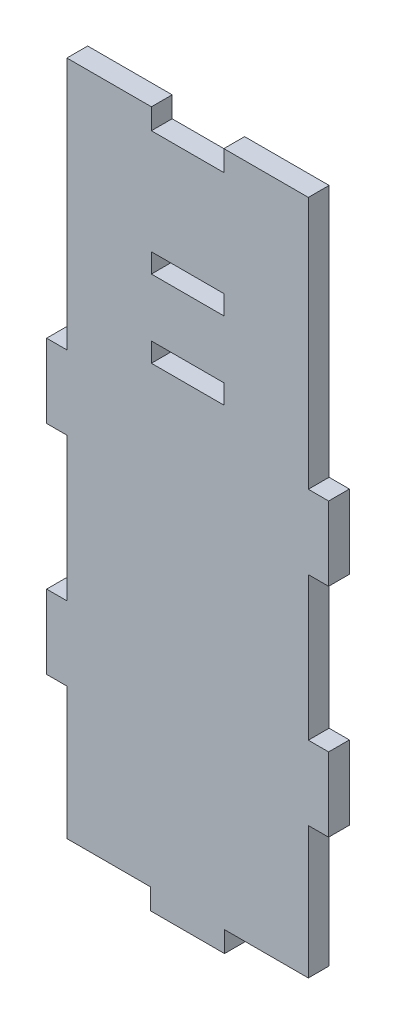
ISO-10303-21;
HEADER;
FILE_DESCRIPTION(('STEP AP214'),'2;1');
FILE_NAME('part.step','',(''),(''),'','','');
FILE_SCHEMA(('AUTOMOTIVE_DESIGN { 1 0 10303 214 1 1 1 1 }'));
ENDSEC;
DATA;
#1=APPLICATION_CONTEXT('core data for automotive mechanical design processes');
#2=APPLICATION_PROTOCOL_DEFINITION('international standard','automotive_design',2000,#1);
#3=PRODUCT_CONTEXT('',#1,'mechanical');
#4=PRODUCT('Part','Part','',(#3));
#5=PRODUCT_RELATED_PRODUCT_CATEGORY('part','',(#4));
#6=PRODUCT_DEFINITION_FORMATION('','',#4);
#7=PRODUCT_DEFINITION_CONTEXT('part definition',#1,'design');
#8=PRODUCT_DEFINITION('design','',#6,#7);
#9=PRODUCT_DEFINITION_SHAPE('','',#8);
#10=(LENGTH_UNIT() NAMED_UNIT(*) SI_UNIT(.MILLI.,.METRE.));
#11=(NAMED_UNIT(*) PLANE_ANGLE_UNIT() SI_UNIT($,.RADIAN.));
#12=(NAMED_UNIT(*) SI_UNIT($,.STERADIAN.) SOLID_ANGLE_UNIT());
#13=UNCERTAINTY_MEASURE_WITH_UNIT(LENGTH_MEASURE(1.E-05),#10,'distance_accuracy_value','');
#14=(GEOMETRIC_REPRESENTATION_CONTEXT(3) GLOBAL_UNCERTAINTY_ASSIGNED_CONTEXT((#13)) GLOBAL_UNIT_ASSIGNED_CONTEXT((#10,
#11,#12)) REPRESENTATION_CONTEXT('',''));
#15=CARTESIAN_POINT('',(0.,0.,0.));
#16=DIRECTION('',(0.,0.,1.));
#17=DIRECTION('',(1.,0.,0.));
#18=AXIS2_PLACEMENT_3D('',#15,#16,#17);
#19=CARTESIAN_POINT('',(0.,0.,4.3));
#20=DIRECTION('',(0.,0.,1.));
#21=DIRECTION('',(1.,0.,0.));
#22=AXIS2_PLACEMENT_3D('',#19,#20,#21);
#23=PLANE('',#22);
#24=DIRECTION('',(-1.,0.,0.));
#25=VECTOR('',#24,1.);
#26=CARTESIAN_POINT('',(7.50000000000001,70.,4.3));
#27=LINE('',#26,#25);
#28=CARTESIAN_POINT('',(25.,70.,4.3));
#29=VERTEX_POINT('',#28);
#30=CARTESIAN_POINT('',(7.50000000000001,70.,4.3));
#31=VERTEX_POINT('',#30);
#32=EDGE_CURVE('E336',#29,#31,#27,.T.);
#33=ORIENTED_EDGE('',*,*,#32,.T.);
#34=DIRECTION('',(0.,-1.,0.));
#35=VECTOR('',#34,1.);
#36=CARTESIAN_POINT('',(7.50000000000001,70.,4.3));
#37=LINE('',#36,#35);
#38=CARTESIAN_POINT('',(7.50000000000002,65.7,4.3));
#39=VERTEX_POINT('',#38);
#40=EDGE_CURVE('E339',#31,#39,#37,.T.);
#41=ORIENTED_EDGE('',*,*,#40,.T.);
#42=DIRECTION('',(-1.,0.,0.));
#43=VECTOR('',#42,1.);
#44=CARTESIAN_POINT('',(-7.49999999999999,65.7,4.3));
#45=LINE('',#44,#43);
#46=CARTESIAN_POINT('',(-7.49999999999999,65.7,4.3));
#47=VERTEX_POINT('',#46);
#48=EDGE_CURVE('E342',#39,#47,#45,.T.);
#49=ORIENTED_EDGE('',*,*,#48,.T.);
#50=DIRECTION('',(0.,1.,0.));
#51=VECTOR('',#50,1.);
#52=CARTESIAN_POINT('',(-7.49999999999998,70.,4.3));
#53=LINE('',#52,#51);
#54=CARTESIAN_POINT('',(-7.49999999999998,70.,4.3));
#55=VERTEX_POINT('',#54);
#56=EDGE_CURVE('E344',#47,#55,#53,.T.);
#57=ORIENTED_EDGE('',*,*,#56,.T.);
#58=DIRECTION('',(-1.,0.,0.));
#59=VECTOR('',#58,1.);
#60=CARTESIAN_POINT('',(-25.,70.,4.3));
#61=LINE('',#60,#59);
#62=CARTESIAN_POINT('',(-25.,70.,4.3));
#63=VERTEX_POINT('',#62);
#64=EDGE_CURVE('E346',#55,#63,#61,.T.);
#65=ORIENTED_EDGE('',*,*,#64,.T.);
#66=DIRECTION('',(0.,-1.,0.));
#67=VECTOR('',#66,1.);
#68=CARTESIAN_POINT('',(-25.,17.65,4.3));
#69=LINE('',#68,#67);
#70=CARTESIAN_POINT('',(-25.,17.65,4.3));
#71=VERTEX_POINT('',#70);
#72=EDGE_CURVE('E348',#63,#71,#69,.T.);
#73=ORIENTED_EDGE('',*,*,#72,.T.);
#74=DIRECTION('',(-1.,0.,0.));
#75=VECTOR('',#74,1.);
#76=CARTESIAN_POINT('',(-25.,17.65,4.3));
#77=LINE('',#76,#75);
#78=CARTESIAN_POINT('',(-29.2,17.65,4.3));
#79=VERTEX_POINT('',#78);
#80=EDGE_CURVE('E350',#71,#79,#77,.T.);
#81=ORIENTED_EDGE('',*,*,#80,.T.);
#82=DIRECTION('',(0.,-1.,0.));
#83=VECTOR('',#82,1.);
#84=CARTESIAN_POINT('',(-29.2,2.34999999999998,4.3));
#85=LINE('',#84,#83);
#86=CARTESIAN_POINT('',(-29.2,2.34999999999998,4.3));
#87=VERTEX_POINT('',#86);
#88=EDGE_CURVE('E352',#79,#87,#85,.T.);
#89=ORIENTED_EDGE('',*,*,#88,.T.);
#90=DIRECTION('',(1.,0.,0.));
#91=VECTOR('',#90,1.);
#92=CARTESIAN_POINT('',(-25.,2.34999999999998,4.3));
#93=LINE('',#92,#91);
#94=CARTESIAN_POINT('',(-25.,2.34999999999998,4.3));
#95=VERTEX_POINT('',#94);
#96=EDGE_CURVE('E354',#87,#95,#93,.T.);
#97=ORIENTED_EDGE('',*,*,#96,.T.);
#98=DIRECTION('',(0.,-1.,0.));
#99=VECTOR('',#98,1.);
#100=CARTESIAN_POINT('',(-25.,-27.35,4.3));
#101=LINE('',#100,#99);
#102=CARTESIAN_POINT('',(-25.,-27.35,4.3));
#103=VERTEX_POINT('',#102);
#104=EDGE_CURVE('E356',#95,#103,#101,.T.);
#105=ORIENTED_EDGE('',*,*,#104,.T.);
#106=DIRECTION('',(-1.,0.,0.));
#107=VECTOR('',#106,1.);
#108=CARTESIAN_POINT('',(-25.,-27.35,4.3));
#109=LINE('',#108,#107);
#110=CARTESIAN_POINT('',(-29.2,-27.35,4.3));
#111=VERTEX_POINT('',#110);
#112=EDGE_CURVE('E358',#103,#111,#109,.T.);
#113=ORIENTED_EDGE('',*,*,#112,.T.);
#114=DIRECTION('',(0.,-1.,0.));
#115=VECTOR('',#114,1.);
#116=CARTESIAN_POINT('',(-29.2,-42.65,4.3));
#117=LINE('',#116,#115);
#118=CARTESIAN_POINT('',(-29.2,-42.65,4.3));
#119=VERTEX_POINT('',#118);
#120=EDGE_CURVE('E360',#111,#119,#117,.T.);
#121=ORIENTED_EDGE('',*,*,#120,.T.);
#122=DIRECTION('',(1.,0.,0.));
#123=VECTOR('',#122,1.);
#124=CARTESIAN_POINT('',(-25.,-42.65,4.3));
#125=LINE('',#124,#123);
#126=CARTESIAN_POINT('',(-25.,-42.65,4.3));
#127=VERTEX_POINT('',#126);
#128=EDGE_CURVE('E362',#119,#127,#125,.T.);
#129=ORIENTED_EDGE('',*,*,#128,.T.);
#130=DIRECTION('',(0.,-1.,0.));
#131=VECTOR('',#130,1.);
#132=CARTESIAN_POINT('',(-25.,-70.,4.3));
#133=LINE('',#132,#131);
#134=CARTESIAN_POINT('',(-25.,-70.,4.3));
#135=VERTEX_POINT('',#134);
#136=EDGE_CURVE('E364',#127,#135,#133,.T.);
#137=ORIENTED_EDGE('',*,*,#136,.T.);
#138=DIRECTION('',(1.,0.,0.));
#139=VECTOR('',#138,1.);
#140=CARTESIAN_POINT('',(-25.,-70.,4.3));
#141=LINE('',#140,#139);
#142=CARTESIAN_POINT('',(-7.64999999999999,-70.,4.3));
#143=VERTEX_POINT('',#142);
#144=EDGE_CURVE('E366',#135,#143,#141,.T.);
#145=ORIENTED_EDGE('',*,*,#144,.T.);
#146=DIRECTION('',(0.,-1.,0.));
#147=VECTOR('',#146,1.);
#148=CARTESIAN_POINT('',(-7.64999999999999,-70.,4.3));
#149=LINE('',#148,#147);
#150=CARTESIAN_POINT('',(-7.64999999999998,-74.3,4.3));
#151=VERTEX_POINT('',#150);
#152=EDGE_CURVE('E368',#143,#151,#149,.T.);
#153=ORIENTED_EDGE('',*,*,#152,.T.);
#154=DIRECTION('',(1.,0.,0.));
#155=VECTOR('',#154,1.);
#156=CARTESIAN_POINT('',(-7.64999999999998,-74.3,4.3));
#157=LINE('',#156,#155);
#158=CARTESIAN_POINT('',(7.65000000000002,-74.3,4.3));
#159=VERTEX_POINT('',#158);
#160=EDGE_CURVE('E370',#151,#159,#157,.T.);
#161=ORIENTED_EDGE('',*,*,#160,.T.);
#162=DIRECTION('',(0.,1.,0.));
#163=VECTOR('',#162,1.);
#164=CARTESIAN_POINT('',(7.65000000000001,-70.,4.3));
#165=LINE('',#164,#163);
#166=CARTESIAN_POINT('',(7.65000000000001,-70.,4.3));
#167=VERTEX_POINT('',#166);
#168=EDGE_CURVE('E372',#159,#167,#165,.T.);
#169=ORIENTED_EDGE('',*,*,#168,.T.);
#170=DIRECTION('',(1.,0.,0.));
#171=VECTOR('',#170,1.);
#172=CARTESIAN_POINT('',(7.65000000000001,-70.,4.3));
#173=LINE('',#172,#171);
#174=CARTESIAN_POINT('',(25.,-70.,4.3));
#175=VERTEX_POINT('',#174);
#176=EDGE_CURVE('E374',#167,#175,#173,.T.);
#177=ORIENTED_EDGE('',*,*,#176,.T.);
#178=DIRECTION('',(0.,1.,0.));
#179=VECTOR('',#178,1.);
#180=CARTESIAN_POINT('',(25.,-70.,4.3));
#181=LINE('',#180,#179);
#182=CARTESIAN_POINT('',(25.,-42.65,4.3));
#183=VERTEX_POINT('',#182);
#184=EDGE_CURVE('E376',#175,#183,#181,.T.);
#185=ORIENTED_EDGE('',*,*,#184,.T.);
#186=DIRECTION('',(1.,0.,0.));
#187=VECTOR('',#186,1.);
#188=CARTESIAN_POINT('',(25.,-42.65,4.3));
#189=LINE('',#188,#187);
#190=CARTESIAN_POINT('',(29.2,-42.65,4.3));
#191=VERTEX_POINT('',#190);
#192=EDGE_CURVE('E378',#183,#191,#189,.T.);
#193=ORIENTED_EDGE('',*,*,#192,.T.);
#194=DIRECTION('',(0.,1.,0.));
#195=VECTOR('',#194,1.);
#196=CARTESIAN_POINT('',(29.2,-42.65,4.3));
#197=LINE('',#196,#195);
#198=CARTESIAN_POINT('',(29.2,-27.35,4.3));
#199=VERTEX_POINT('',#198);
#200=EDGE_CURVE('E380',#191,#199,#197,.T.);
#201=ORIENTED_EDGE('',*,*,#200,.T.);
#202=DIRECTION('',(-1.,0.,0.));
#203=VECTOR('',#202,1.);
#204=CARTESIAN_POINT('',(25.,-27.35,4.3));
#205=LINE('',#204,#203);
#206=CARTESIAN_POINT('',(25.,-27.35,4.3));
#207=VERTEX_POINT('',#206);
#208=EDGE_CURVE('E382',#199,#207,#205,.T.);
#209=ORIENTED_EDGE('',*,*,#208,.T.);
#210=DIRECTION('',(0.,1.,0.));
#211=VECTOR('',#210,1.);
#212=CARTESIAN_POINT('',(25.,-27.35,4.3));
#213=LINE('',#212,#211);
#214=CARTESIAN_POINT('',(25.,2.34999999999998,4.3));
#215=VERTEX_POINT('',#214);
#216=EDGE_CURVE('E384',#207,#215,#213,.T.);
#217=ORIENTED_EDGE('',*,*,#216,.T.);
#218=DIRECTION('',(1.,0.,0.));
#219=VECTOR('',#218,1.);
#220=CARTESIAN_POINT('',(25.,2.34999999999998,4.3));
#221=LINE('',#220,#219);
#222=CARTESIAN_POINT('',(29.2,2.34999999999998,4.3));
#223=VERTEX_POINT('',#222);
#224=EDGE_CURVE('E386',#215,#223,#221,.T.);
#225=ORIENTED_EDGE('',*,*,#224,.T.);
#226=DIRECTION('',(0.,1.,0.));
#227=VECTOR('',#226,1.);
#228=CARTESIAN_POINT('',(29.2,2.34999999999998,4.3));
#229=LINE('',#228,#227);
#230=CARTESIAN_POINT('',(29.2,17.65,4.3));
#231=VERTEX_POINT('',#230);
#232=EDGE_CURVE('E388',#223,#231,#229,.T.);
#233=ORIENTED_EDGE('',*,*,#232,.T.);
#234=DIRECTION('',(-1.,0.,0.));
#235=VECTOR('',#234,1.);
#236=CARTESIAN_POINT('',(25.,17.65,4.3));
#237=LINE('',#236,#235);
#238=CARTESIAN_POINT('',(25.,17.65,4.3));
#239=VERTEX_POINT('',#238);
#240=EDGE_CURVE('E390',#231,#239,#237,.T.);
#241=ORIENTED_EDGE('',*,*,#240,.T.);
#242=DIRECTION('',(0.,1.,0.));
#243=VECTOR('',#242,1.);
#244=CARTESIAN_POINT('',(25.,17.65,4.3));
#245=LINE('',#244,#243);
#246=EDGE_CURVE('E392',#239,#29,#245,.T.);
#247=ORIENTED_EDGE('',*,*,#246,.T.);
#248=EDGE_LOOP('',(#33,#41,#49,#57,#65,#73,#81,#89,#97,#105,#113,#121,#129,#137,#145,#153,#161,
#169,#177,#185,#193,#201,#209,#217,#225,#233,#241,#247));
#249=FACE_BOUND('',#248,.T.);
#250=DIRECTION('',(-1.,0.,0.));
#251=VECTOR('',#250,1.);
#252=CARTESIAN_POINT('',(-7.49999999999999,44.,4.3));
#253=LINE('',#252,#251);
#254=CARTESIAN_POINT('',(7.50000000000001,44.,4.3));
#255=VERTEX_POINT('',#254);
#256=CARTESIAN_POINT('',(-7.49999999999999,44.,4.3));
#257=VERTEX_POINT('',#256);
#258=EDGE_CURVE('E307',#255,#257,#253,.T.);
#259=ORIENTED_EDGE('',*,*,#258,.F.);
#260=DIRECTION('',(0.,1.,0.));
#261=VECTOR('',#260,1.);
#262=CARTESIAN_POINT('',(7.50000000000001,44.,4.3));
#263=LINE('',#262,#261);
#264=CARTESIAN_POINT('',(7.50000000000001,40.,4.3));
#265=VERTEX_POINT('',#264);
#266=EDGE_CURVE('E305',#265,#255,#263,.T.);
#267=ORIENTED_EDGE('',*,*,#266,.F.);
#268=DIRECTION('',(1.,0.,0.));
#269=VECTOR('',#268,1.);
#270=CARTESIAN_POINT('',(-7.49999999999999,40.,4.3));
#271=LINE('',#270,#269);
#272=CARTESIAN_POINT('',(-7.49999999999999,40.,4.3));
#273=VERTEX_POINT('',#272);
#274=EDGE_CURVE('E313',#273,#265,#271,.T.);
#275=ORIENTED_EDGE('',*,*,#274,.F.);
#276=DIRECTION('',(0.,-1.,0.));
#277=VECTOR('',#276,1.);
#278=CARTESIAN_POINT('',(-7.49999999999999,44.,4.3));
#279=LINE('',#278,#277);
#280=EDGE_CURVE('E310',#257,#273,#279,.T.);
#281=ORIENTED_EDGE('',*,*,#280,.F.);
#282=EDGE_LOOP('',(#259,#267,#275,#281));
#283=FACE_BOUND('',#282,.T.);
#284=DIRECTION('',(-1.,0.,0.));
#285=VECTOR('',#284,1.);
#286=CARTESIAN_POINT('',(-7.50000000000001,28.,4.3));
#287=LINE('',#286,#285);
#288=CARTESIAN_POINT('',(7.50000000000002,28.,4.3));
#289=VERTEX_POINT('',#288);
#290=CARTESIAN_POINT('',(-7.50000000000001,28.,4.3));
#291=VERTEX_POINT('',#290);
#292=EDGE_CURVE('E277',#289,#291,#287,.T.);
#293=ORIENTED_EDGE('',*,*,#292,.F.);
#294=DIRECTION('',(0.,1.,0.));
#295=VECTOR('',#294,1.);
#296=CARTESIAN_POINT('',(7.50000000000002,24.,4.3));
#297=LINE('',#296,#295);
#298=CARTESIAN_POINT('',(7.50000000000002,24.,4.3));
#299=VERTEX_POINT('',#298);
#300=EDGE_CURVE('E269',#299,#289,#297,.T.);
#301=ORIENTED_EDGE('',*,*,#300,.F.);
#302=DIRECTION('',(1.,0.,0.));
#303=VECTOR('',#302,1.);
#304=CARTESIAN_POINT('',(-7.50000000000001,24.,4.3));
#305=LINE('',#304,#303);
#306=CARTESIAN_POINT('',(-7.50000000000001,24.,4.3));
#307=VERTEX_POINT('',#306);
#308=EDGE_CURVE('E291',#307,#299,#305,.T.);
#309=ORIENTED_EDGE('',*,*,#308,.F.);
#310=DIRECTION('',(0.,-1.,0.));
#311=VECTOR('',#310,1.);
#312=CARTESIAN_POINT('',(-7.50000000000001,24.,4.3));
#313=LINE('',#312,#311);
#314=EDGE_CURVE('E289',#291,#307,#313,.T.);
#315=ORIENTED_EDGE('',*,*,#314,.F.);
#316=EDGE_LOOP('',(#293,#301,#309,#315));
#317=FACE_BOUND('',#316,.T.);
#318=ADVANCED_FACE('F36',(#249,#283,#317),#23,.T.);
#319=CARTESIAN_POINT('',(0.,0.,0.));
#320=DIRECTION('',(0.,0.,1.));
#321=DIRECTION('',(1.,0.,0.));
#322=AXIS2_PLACEMENT_3D('',#319,#320,#321);
#323=PLANE('',#322);
#324=DIRECTION('',(0.,1.,0.));
#325=VECTOR('',#324,1.);
#326=CARTESIAN_POINT('',(7.50000000000001,44.,0.));
#327=LINE('',#326,#325);
#328=CARTESIAN_POINT('',(7.50000000000001,40.,0.));
#329=VERTEX_POINT('',#328);
#330=CARTESIAN_POINT('',(7.50000000000001,44.,0.));
#331=VERTEX_POINT('',#330);
#332=EDGE_CURVE('E285',#329,#331,#327,.T.);
#333=ORIENTED_EDGE('',*,*,#332,.T.);
#334=DIRECTION('',(-1.,0.,0.));
#335=VECTOR('',#334,1.);
#336=CARTESIAN_POINT('',(-7.49999999999999,44.,0.));
#337=LINE('',#336,#335);
#338=CARTESIAN_POINT('',(-7.49999999999999,44.,0.));
#339=VERTEX_POINT('',#338);
#340=EDGE_CURVE('E318',#331,#339,#337,.T.);
#341=ORIENTED_EDGE('',*,*,#340,.T.);
#342=DIRECTION('',(0.,-1.,0.));
#343=VECTOR('',#342,1.);
#344=CARTESIAN_POINT('',(-7.49999999999999,44.,0.));
#345=LINE('',#344,#343);
#346=CARTESIAN_POINT('',(-7.49999999999999,40.,0.));
#347=VERTEX_POINT('',#346);
#348=EDGE_CURVE('E321',#339,#347,#345,.T.);
#349=ORIENTED_EDGE('',*,*,#348,.T.);
#350=DIRECTION('',(1.,0.,0.));
#351=VECTOR('',#350,1.);
#352=CARTESIAN_POINT('',(-7.49999999999999,40.,0.));
#353=LINE('',#352,#351);
#354=EDGE_CURVE('E308',#347,#329,#353,.T.);
#355=ORIENTED_EDGE('',*,*,#354,.T.);
#356=EDGE_LOOP('',(#333,#341,#349,#355));
#357=FACE_BOUND('',#356,.T.);
#358=DIRECTION('',(-1.,0.,0.));
#359=VECTOR('',#358,1.);
#360=CARTESIAN_POINT('',(7.50000000000001,70.,0.));
#361=LINE('',#360,#359);
#362=CARTESIAN_POINT('',(25.,70.,0.));
#363=VERTEX_POINT('',#362);
#364=CARTESIAN_POINT('',(7.50000000000001,70.,0.));
#365=VERTEX_POINT('',#364);
#366=EDGE_CURVE('E335',#363,#365,#361,.T.);
#367=ORIENTED_EDGE('',*,*,#366,.F.);
#368=DIRECTION('',(0.,1.,0.));
#369=VECTOR('',#368,1.);
#370=CARTESIAN_POINT('',(25.,17.65,0.));
#371=LINE('',#370,#369);
#372=CARTESIAN_POINT('',(25.,17.65,0.));
#373=VERTEX_POINT('',#372);
#374=EDGE_CURVE('E340',#373,#363,#371,.T.);
#375=ORIENTED_EDGE('',*,*,#374,.F.);
#376=DIRECTION('',(-1.,0.,0.));
#377=VECTOR('',#376,1.);
#378=CARTESIAN_POINT('',(25.,17.65,0.));
#379=LINE('',#378,#377);
#380=CARTESIAN_POINT('',(29.2,17.65,0.));
#381=VERTEX_POINT('',#380);
#382=EDGE_CURVE('E447',#381,#373,#379,.T.);
#383=ORIENTED_EDGE('',*,*,#382,.F.);
#384=DIRECTION('',(0.,1.,0.));
#385=VECTOR('',#384,1.);
#386=CARTESIAN_POINT('',(29.2,2.34999999999998,0.));
#387=LINE('',#386,#385);
#388=CARTESIAN_POINT('',(29.2,2.34999999999998,0.));
#389=VERTEX_POINT('',#388);
#390=EDGE_CURVE('E445',#389,#381,#387,.T.);
#391=ORIENTED_EDGE('',*,*,#390,.F.);
#392=DIRECTION('',(1.,0.,0.));
#393=VECTOR('',#392,1.);
#394=CARTESIAN_POINT('',(25.,2.34999999999998,0.));
#395=LINE('',#394,#393);
#396=CARTESIAN_POINT('',(25.,2.34999999999998,0.));
#397=VERTEX_POINT('',#396);
#398=EDGE_CURVE('E443',#397,#389,#395,.T.);
#399=ORIENTED_EDGE('',*,*,#398,.F.);
#400=DIRECTION('',(0.,1.,0.));
#401=VECTOR('',#400,1.);
#402=CARTESIAN_POINT('',(25.,-27.35,0.));
#403=LINE('',#402,#401);
#404=CARTESIAN_POINT('',(25.,-27.35,0.));
#405=VERTEX_POINT('',#404);
#406=EDGE_CURVE('E441',#405,#397,#403,.T.);
#407=ORIENTED_EDGE('',*,*,#406,.F.);
#408=DIRECTION('',(-1.,0.,0.));
#409=VECTOR('',#408,1.);
#410=CARTESIAN_POINT('',(25.,-27.35,0.));
#411=LINE('',#410,#409);
#412=CARTESIAN_POINT('',(29.2,-27.35,0.));
#413=VERTEX_POINT('',#412);
#414=EDGE_CURVE('E439',#413,#405,#411,.T.);
#415=ORIENTED_EDGE('',*,*,#414,.F.);
#416=DIRECTION('',(0.,1.,0.));
#417=VECTOR('',#416,1.);
#418=CARTESIAN_POINT('',(29.2,-42.65,0.));
#419=LINE('',#418,#417);
#420=CARTESIAN_POINT('',(29.2,-42.65,0.));
#421=VERTEX_POINT('',#420);
#422=EDGE_CURVE('E437',#421,#413,#419,.T.);
#423=ORIENTED_EDGE('',*,*,#422,.F.);
#424=DIRECTION('',(1.,0.,0.));
#425=VECTOR('',#424,1.);
#426=CARTESIAN_POINT('',(25.,-42.65,0.));
#427=LINE('',#426,#425);
#428=CARTESIAN_POINT('',(25.,-42.65,0.));
#429=VERTEX_POINT('',#428);
#430=EDGE_CURVE('E435',#429,#421,#427,.T.);
#431=ORIENTED_EDGE('',*,*,#430,.F.);
#432=DIRECTION('',(0.,1.,0.));
#433=VECTOR('',#432,1.);
#434=CARTESIAN_POINT('',(25.,-70.,0.));
#435=LINE('',#434,#433);
#436=CARTESIAN_POINT('',(25.,-70.,0.));
#437=VERTEX_POINT('',#436);
#438=EDGE_CURVE('E433',#437,#429,#435,.T.);
#439=ORIENTED_EDGE('',*,*,#438,.F.);
#440=DIRECTION('',(1.,0.,0.));
#441=VECTOR('',#440,1.);
#442=CARTESIAN_POINT('',(7.65000000000001,-70.,0.));
#443=LINE('',#442,#441);
#444=CARTESIAN_POINT('',(7.65000000000001,-70.,0.));
#445=VERTEX_POINT('',#444);
#446=EDGE_CURVE('E431',#445,#437,#443,.T.);
#447=ORIENTED_EDGE('',*,*,#446,.F.);
#448=DIRECTION('',(0.,1.,0.));
#449=VECTOR('',#448,1.);
#450=CARTESIAN_POINT('',(7.65000000000001,-70.,0.));
#451=LINE('',#450,#449);
#452=CARTESIAN_POINT('',(7.65000000000002,-74.3,0.));
#453=VERTEX_POINT('',#452);
#454=EDGE_CURVE('E429',#453,#445,#451,.T.);
#455=ORIENTED_EDGE('',*,*,#454,.F.);
#456=DIRECTION('',(1.,0.,0.));
#457=VECTOR('',#456,1.);
#458=CARTESIAN_POINT('',(-7.64999999999998,-74.3,0.));
#459=LINE('',#458,#457);
#460=CARTESIAN_POINT('',(-7.64999999999998,-74.3,0.));
#461=VERTEX_POINT('',#460);
#462=EDGE_CURVE('E427',#461,#453,#459,.T.);
#463=ORIENTED_EDGE('',*,*,#462,.F.);
#464=DIRECTION('',(0.,-1.,0.));
#465=VECTOR('',#464,1.);
#466=CARTESIAN_POINT('',(-7.64999999999999,-70.,0.));
#467=LINE('',#466,#465);
#468=CARTESIAN_POINT('',(-7.64999999999999,-70.,0.));
#469=VERTEX_POINT('',#468);
#470=EDGE_CURVE('E425',#469,#461,#467,.T.);
#471=ORIENTED_EDGE('',*,*,#470,.F.);
#472=DIRECTION('',(1.,0.,0.));
#473=VECTOR('',#472,1.);
#474=CARTESIAN_POINT('',(-25.,-70.,0.));
#475=LINE('',#474,#473);
#476=CARTESIAN_POINT('',(-25.,-70.,0.));
#477=VERTEX_POINT('',#476);
#478=EDGE_CURVE('E423',#477,#469,#475,.T.);
#479=ORIENTED_EDGE('',*,*,#478,.F.);
#480=DIRECTION('',(0.,-1.,0.));
#481=VECTOR('',#480,1.);
#482=CARTESIAN_POINT('',(-25.,-70.,0.));
#483=LINE('',#482,#481);
#484=CARTESIAN_POINT('',(-25.,-42.65,0.));
#485=VERTEX_POINT('',#484);
#486=EDGE_CURVE('E421',#485,#477,#483,.T.);
#487=ORIENTED_EDGE('',*,*,#486,.F.);
#488=DIRECTION('',(1.,0.,0.));
#489=VECTOR('',#488,1.);
#490=CARTESIAN_POINT('',(-25.,-42.65,0.));
#491=LINE('',#490,#489);
#492=CARTESIAN_POINT('',(-29.2,-42.65,0.));
#493=VERTEX_POINT('',#492);
#494=EDGE_CURVE('E419',#493,#485,#491,.T.);
#495=ORIENTED_EDGE('',*,*,#494,.F.);
#496=DIRECTION('',(0.,-1.,0.));
#497=VECTOR('',#496,1.);
#498=CARTESIAN_POINT('',(-29.2,-42.65,0.));
#499=LINE('',#498,#497);
#500=CARTESIAN_POINT('',(-29.2,-27.35,0.));
#501=VERTEX_POINT('',#500);
#502=EDGE_CURVE('E417',#501,#493,#499,.T.);
#503=ORIENTED_EDGE('',*,*,#502,.F.);
#504=DIRECTION('',(-1.,0.,0.));
#505=VECTOR('',#504,1.);
#506=CARTESIAN_POINT('',(-25.,-27.35,0.));
#507=LINE('',#506,#505);
#508=CARTESIAN_POINT('',(-25.,-27.35,0.));
#509=VERTEX_POINT('',#508);
#510=EDGE_CURVE('E415',#509,#501,#507,.T.);
#511=ORIENTED_EDGE('',*,*,#510,.F.);
#512=DIRECTION('',(0.,-1.,0.));
#513=VECTOR('',#512,1.);
#514=CARTESIAN_POINT('',(-25.,-27.35,0.));
#515=LINE('',#514,#513);
#516=CARTESIAN_POINT('',(-25.,2.34999999999998,0.));
#517=VERTEX_POINT('',#516);
#518=EDGE_CURVE('E413',#517,#509,#515,.T.);
#519=ORIENTED_EDGE('',*,*,#518,.F.);
#520=DIRECTION('',(1.,0.,0.));
#521=VECTOR('',#520,1.);
#522=CARTESIAN_POINT('',(-25.,2.34999999999998,0.));
#523=LINE('',#522,#521);
#524=CARTESIAN_POINT('',(-29.2,2.34999999999998,0.));
#525=VERTEX_POINT('',#524);
#526=EDGE_CURVE('E411',#525,#517,#523,.T.);
#527=ORIENTED_EDGE('',*,*,#526,.F.);
#528=DIRECTION('',(0.,-1.,0.));
#529=VECTOR('',#528,1.);
#530=CARTESIAN_POINT('',(-29.2,2.34999999999998,0.));
#531=LINE('',#530,#529);
#532=CARTESIAN_POINT('',(-29.2,17.65,0.));
#533=VERTEX_POINT('',#532);
#534=EDGE_CURVE('E409',#533,#525,#531,.T.);
#535=ORIENTED_EDGE('',*,*,#534,.F.);
#536=DIRECTION('',(-1.,0.,0.));
#537=VECTOR('',#536,1.);
#538=CARTESIAN_POINT('',(-25.,17.65,0.));
#539=LINE('',#538,#537);
#540=CARTESIAN_POINT('',(-25.,17.65,0.));
#541=VERTEX_POINT('',#540);
#542=EDGE_CURVE('E407',#541,#533,#539,.T.);
#543=ORIENTED_EDGE('',*,*,#542,.F.);
#544=DIRECTION('',(0.,-1.,0.));
#545=VECTOR('',#544,1.);
#546=CARTESIAN_POINT('',(-25.,17.65,0.));
#547=LINE('',#546,#545);
#548=CARTESIAN_POINT('',(-25.,70.,0.));
#549=VERTEX_POINT('',#548);
#550=EDGE_CURVE('E405',#549,#541,#547,.T.);
#551=ORIENTED_EDGE('',*,*,#550,.F.);
#552=DIRECTION('',(-1.,0.,0.));
#553=VECTOR('',#552,1.);
#554=CARTESIAN_POINT('',(-25.,70.,0.));
#555=LINE('',#554,#553);
#556=CARTESIAN_POINT('',(-7.49999999999998,70.,0.));
#557=VERTEX_POINT('',#556);
#558=EDGE_CURVE('E403',#557,#549,#555,.T.);
#559=ORIENTED_EDGE('',*,*,#558,.F.);
#560=DIRECTION('',(0.,1.,0.));
#561=VECTOR('',#560,1.);
#562=CARTESIAN_POINT('',(-7.49999999999998,70.,0.));
#563=LINE('',#562,#561);
#564=CARTESIAN_POINT('',(-7.49999999999999,65.7,0.));
#565=VERTEX_POINT('',#564);
#566=EDGE_CURVE('E401',#565,#557,#563,.T.);
#567=ORIENTED_EDGE('',*,*,#566,.F.);
#568=DIRECTION('',(-1.,0.,0.));
#569=VECTOR('',#568,1.);
#570=CARTESIAN_POINT('',(-7.49999999999999,65.7,0.));
#571=LINE('',#570,#569);
#572=CARTESIAN_POINT('',(7.50000000000002,65.7,0.));
#573=VERTEX_POINT('',#572);
#574=EDGE_CURVE('E399',#573,#565,#571,.T.);
#575=ORIENTED_EDGE('',*,*,#574,.F.);
#576=DIRECTION('',(0.,-1.,0.));
#577=VECTOR('',#576,1.);
#578=CARTESIAN_POINT('',(7.50000000000001,70.,0.));
#579=LINE('',#578,#577);
#580=EDGE_CURVE('E397',#365,#573,#579,.T.);
#581=ORIENTED_EDGE('',*,*,#580,.F.);
#582=EDGE_LOOP('',(#367,#375,#383,#391,#399,#407,#415,#423,#431,#439,#447,#455,#463,#471,#479,
#487,#495,#503,#511,#519,#527,#535,#543,#551,#559,#567,#575,#581));
#583=FACE_BOUND('',#582,.T.);
#584=DIRECTION('',(0.,1.,0.));
#585=VECTOR('',#584,1.);
#586=CARTESIAN_POINT('',(7.50000000000002,24.,0.));
#587=LINE('',#586,#585);
#588=CARTESIAN_POINT('',(7.50000000000002,24.,0.));
#589=VERTEX_POINT('',#588);
#590=CARTESIAN_POINT('',(7.50000000000002,28.,0.));
#591=VERTEX_POINT('',#590);
#592=EDGE_CURVE('E59',#589,#591,#587,.T.);
#593=ORIENTED_EDGE('',*,*,#592,.T.);
#594=DIRECTION('',(-1.,0.,0.));
#595=VECTOR('',#594,1.);
#596=CARTESIAN_POINT('',(-7.50000000000001,28.,0.));
#597=LINE('',#596,#595);
#598=CARTESIAN_POINT('',(-7.50000000000001,28.,0.));
#599=VERTEX_POINT('',#598);
#600=EDGE_CURVE('E284',#591,#599,#597,.T.);
#601=ORIENTED_EDGE('',*,*,#600,.T.);
#602=DIRECTION('',(0.,-1.,0.));
#603=VECTOR('',#602,1.);
#604=CARTESIAN_POINT('',(-7.50000000000001,24.,0.));
#605=LINE('',#604,#603);
#606=CARTESIAN_POINT('',(-7.50000000000001,24.,0.));
#607=VERTEX_POINT('',#606);
#608=EDGE_CURVE('E297',#599,#607,#605,.T.);
#609=ORIENTED_EDGE('',*,*,#608,.T.);
#610=DIRECTION('',(1.,0.,0.));
#611=VECTOR('',#610,1.);
#612=CARTESIAN_POINT('',(-7.50000000000001,24.,0.));
#613=LINE('',#612,#611);
#614=EDGE_CURVE('E278',#607,#589,#613,.T.);
#615=ORIENTED_EDGE('',*,*,#614,.T.);
#616=EDGE_LOOP('',(#593,#601,#609,#615));
#617=FACE_BOUND('',#616,.T.);
#618=ADVANCED_FACE('F537',(#357,#583,#617),#323,.F.);
#619=CARTESIAN_POINT('',(7.50000000000001,70.,4.3));
#620=DIRECTION('',(0.,-1.,0.));
#621=DIRECTION('',(0.,0.,-1.));
#622=AXIS2_PLACEMENT_3D('',#619,#620,#621);
#623=PLANE('',#622);
#624=ORIENTED_EDGE('',*,*,#366,.T.);
#625=DIRECTION('',(0.,0.,-1.));
#626=VECTOR('',#625,1.);
#627=CARTESIAN_POINT('',(7.50000000000001,70.,4.3));
#628=LINE('',#627,#626);
#629=EDGE_CURVE('E11',#31,#365,#628,.T.);
#630=ORIENTED_EDGE('',*,*,#629,.F.);
#631=ORIENTED_EDGE('',*,*,#32,.F.);
#632=DIRECTION('',(0.,0.,-1.));
#633=VECTOR('',#632,1.);
#634=CARTESIAN_POINT('',(25.,70.,4.3));
#635=LINE('',#634,#633);
#636=EDGE_CURVE('E394',#29,#363,#635,.T.);
#637=ORIENTED_EDGE('',*,*,#636,.T.);
#638=EDGE_LOOP('',(#624,#630,#631,#637));
#639=FACE_BOUND('',#638,.T.);
#640=ADVANCED_FACE('F38',(#639),#623,.F.);
#641=CARTESIAN_POINT('',(7.50000000000001,70.,4.3));
#642=DIRECTION('',(1.,0.,0.));
#643=DIRECTION('',(0.,1.,0.));
#644=AXIS2_PLACEMENT_3D('',#641,#642,#643);
#645=PLANE('',#644);
#646=ORIENTED_EDGE('',*,*,#580,.T.);
#647=DIRECTION('',(0.,0.,-1.));
#648=VECTOR('',#647,1.);
#649=CARTESIAN_POINT('',(7.50000000000002,65.7,4.3));
#650=LINE('',#649,#648);
#651=EDGE_CURVE('E44',#39,#573,#650,.T.);
#652=ORIENTED_EDGE('',*,*,#651,.F.);
#653=ORIENTED_EDGE('',*,*,#40,.F.);
#654=ORIENTED_EDGE('',*,*,#629,.T.);
#655=EDGE_LOOP('',(#646,#652,#653,#654));
#656=FACE_BOUND('',#655,.T.);
#657=ADVANCED_FACE('F555',(#656),#645,.F.);
#658=CARTESIAN_POINT('',(-7.49999999999999,65.7,4.3));
#659=DIRECTION('',(0.,-1.,0.));
#660=DIRECTION('',(0.,0.,-1.));
#661=AXIS2_PLACEMENT_3D('',#658,#659,#660);
#662=PLANE('',#661);
#663=ORIENTED_EDGE('',*,*,#574,.T.);
#664=DIRECTION('',(0.,0.,-1.));
#665=VECTOR('',#664,1.);
#666=CARTESIAN_POINT('',(-7.49999999999999,65.7,4.3));
#667=LINE('',#666,#665);
#668=EDGE_CURVE('E524',#47,#565,#667,.T.);
#669=ORIENTED_EDGE('',*,*,#668,.F.);
#670=ORIENTED_EDGE('',*,*,#48,.F.);
#671=ORIENTED_EDGE('',*,*,#651,.T.);
#672=EDGE_LOOP('',(#663,#669,#670,#671));
#673=FACE_BOUND('',#672,.T.);
#674=ADVANCED_FACE('F531',(#673),#662,.F.);
#675=CARTESIAN_POINT('',(-7.49999999999998,70.,4.3));
#676=DIRECTION('',(-1.,0.,0.));
#677=DIRECTION('',(0.,-1.,0.));
#678=AXIS2_PLACEMENT_3D('',#675,#676,#677);
#679=PLANE('',#678);
#680=ORIENTED_EDGE('',*,*,#566,.T.);
#681=DIRECTION('',(0.,0.,-1.));
#682=VECTOR('',#681,1.);
#683=CARTESIAN_POINT('',(-7.49999999999998,70.,4.3));
#684=LINE('',#683,#682);
#685=EDGE_CURVE('E521',#55,#557,#684,.T.);
#686=ORIENTED_EDGE('',*,*,#685,.F.);
#687=ORIENTED_EDGE('',*,*,#56,.F.);
#688=ORIENTED_EDGE('',*,*,#668,.T.);
#689=EDGE_LOOP('',(#680,#686,#687,#688));
#690=FACE_BOUND('',#689,.T.);
#691=ADVANCED_FACE('F543',(#690),#679,.F.);
#692=CARTESIAN_POINT('',(-25.,70.,4.3));
#693=DIRECTION('',(0.,-1.,0.));
#694=DIRECTION('',(0.,0.,-1.));
#695=AXIS2_PLACEMENT_3D('',#692,#693,#694);
#696=PLANE('',#695);
#697=ORIENTED_EDGE('',*,*,#558,.T.);
#698=DIRECTION('',(0.,0.,-1.));
#699=VECTOR('',#698,1.);
#700=CARTESIAN_POINT('',(-25.,70.,4.3));
#701=LINE('',#700,#699);
#702=EDGE_CURVE('E518',#63,#549,#701,.T.);
#703=ORIENTED_EDGE('',*,*,#702,.F.);
#704=ORIENTED_EDGE('',*,*,#64,.F.);
#705=ORIENTED_EDGE('',*,*,#685,.T.);
#706=EDGE_LOOP('',(#697,#703,#704,#705));
#707=FACE_BOUND('',#706,.T.);
#708=ADVANCED_FACE('F547',(#707),#696,.F.);
#709=CARTESIAN_POINT('',(-25.,17.65,4.3));
#710=DIRECTION('',(1.,0.,0.));
#711=DIRECTION('',(0.,0.,-1.));
#712=AXIS2_PLACEMENT_3D('',#709,#710,#711);
#713=PLANE('',#712);
#714=ORIENTED_EDGE('',*,*,#550,.T.);
#715=DIRECTION('',(0.,0.,-1.));
#716=VECTOR('',#715,1.);
#717=CARTESIAN_POINT('',(-25.,17.65,4.3));
#718=LINE('',#717,#716);
#719=EDGE_CURVE('E515',#71,#541,#718,.T.);
#720=ORIENTED_EDGE('',*,*,#719,.F.);
#721=ORIENTED_EDGE('',*,*,#72,.F.);
#722=ORIENTED_EDGE('',*,*,#702,.T.);
#723=EDGE_LOOP('',(#714,#720,#721,#722));
#724=FACE_BOUND('',#723,.T.);
#725=ADVANCED_FACE('F668',(#724),#713,.F.);
#726=CARTESIAN_POINT('',(-25.,17.65,4.3));
#727=DIRECTION('',(0.,-1.,0.));
#728=DIRECTION('',(0.,0.,-1.));
#729=AXIS2_PLACEMENT_3D('',#726,#727,#728);
#730=PLANE('',#729);
#731=ORIENTED_EDGE('',*,*,#542,.T.);
#732=DIRECTION('',(0.,0.,-1.));
#733=VECTOR('',#732,1.);
#734=CARTESIAN_POINT('',(-29.2,17.65,4.3));
#735=LINE('',#734,#733);
#736=EDGE_CURVE('E512',#79,#533,#735,.T.);
#737=ORIENTED_EDGE('',*,*,#736,.F.);
#738=ORIENTED_EDGE('',*,*,#80,.F.);
#739=ORIENTED_EDGE('',*,*,#719,.T.);
#740=EDGE_LOOP('',(#731,#737,#738,#739));
#741=FACE_BOUND('',#740,.T.);
#742=ADVANCED_FACE('F665',(#741),#730,.F.);
#743=CARTESIAN_POINT('',(-29.2,2.34999999999998,4.3));
#744=DIRECTION('',(1.,0.,0.));
#745=DIRECTION('',(0.,0.,-1.));
#746=AXIS2_PLACEMENT_3D('',#743,#744,#745);
#747=PLANE('',#746);
#748=ORIENTED_EDGE('',*,*,#534,.T.);
#749=DIRECTION('',(0.,0.,-1.));
#750=VECTOR('',#749,1.);
#751=CARTESIAN_POINT('',(-29.2,2.34999999999998,4.3));
#752=LINE('',#751,#750);
#753=EDGE_CURVE('E509',#87,#525,#752,.T.);
#754=ORIENTED_EDGE('',*,*,#753,.F.);
#755=ORIENTED_EDGE('',*,*,#88,.F.);
#756=ORIENTED_EDGE('',*,*,#736,.T.);
#757=EDGE_LOOP('',(#748,#754,#755,#756));
#758=FACE_BOUND('',#757,.T.);
#759=ADVANCED_FACE('F661',(#758),#747,.F.);
#760=CARTESIAN_POINT('',(-25.,2.34999999999998,4.3));
#761=DIRECTION('',(0.,1.,0.));
#762=DIRECTION('',(0.,0.,1.));
#763=AXIS2_PLACEMENT_3D('',#760,#761,#762);
#764=PLANE('',#763);
#765=ORIENTED_EDGE('',*,*,#526,.T.);
#766=DIRECTION('',(0.,0.,-1.));
#767=VECTOR('',#766,1.);
#768=CARTESIAN_POINT('',(-25.,2.34999999999998,4.3));
#769=LINE('',#768,#767);
#770=EDGE_CURVE('E506',#95,#517,#769,.T.);
#771=ORIENTED_EDGE('',*,*,#770,.F.);
#772=ORIENTED_EDGE('',*,*,#96,.F.);
#773=ORIENTED_EDGE('',*,*,#753,.T.);
#774=EDGE_LOOP('',(#765,#771,#772,#773));
#775=FACE_BOUND('',#774,.T.);
#776=ADVANCED_FACE('F657',(#775),#764,.F.);
#777=CARTESIAN_POINT('',(-25.,-27.35,4.3));
#778=DIRECTION('',(1.,0.,0.));
#779=DIRECTION('',(0.,0.,-1.));
#780=AXIS2_PLACEMENT_3D('',#777,#778,#779);
#781=PLANE('',#780);
#782=ORIENTED_EDGE('',*,*,#518,.T.);
#783=DIRECTION('',(0.,0.,-1.));
#784=VECTOR('',#783,1.);
#785=CARTESIAN_POINT('',(-25.,-27.35,4.3));
#786=LINE('',#785,#784);
#787=EDGE_CURVE('E503',#103,#509,#786,.T.);
#788=ORIENTED_EDGE('',*,*,#787,.F.);
#789=ORIENTED_EDGE('',*,*,#104,.F.);
#790=ORIENTED_EDGE('',*,*,#770,.T.);
#791=EDGE_LOOP('',(#782,#788,#789,#790));
#792=FACE_BOUND('',#791,.T.);
#793=ADVANCED_FACE('F652',(#792),#781,.F.);
#794=CARTESIAN_POINT('',(-25.,-27.35,4.3));
#795=DIRECTION('',(0.,-1.,0.));
#796=DIRECTION('',(0.,0.,-1.));
#797=AXIS2_PLACEMENT_3D('',#794,#795,#796);
#798=PLANE('',#797);
#799=ORIENTED_EDGE('',*,*,#510,.T.);
#800=DIRECTION('',(0.,0.,-1.));
#801=VECTOR('',#800,1.);
#802=CARTESIAN_POINT('',(-29.2,-27.35,4.3));
#803=LINE('',#802,#801);
#804=EDGE_CURVE('E500',#111,#501,#803,.T.);
#805=ORIENTED_EDGE('',*,*,#804,.F.);
#806=ORIENTED_EDGE('',*,*,#112,.F.);
#807=ORIENTED_EDGE('',*,*,#787,.T.);
#808=EDGE_LOOP('',(#799,#805,#806,#807));
#809=FACE_BOUND('',#808,.T.);
#810=ADVANCED_FACE('F646',(#809),#798,.F.);
#811=CARTESIAN_POINT('',(-29.2,-42.65,4.3));
#812=DIRECTION('',(1.,0.,0.));
#813=DIRECTION('',(0.,0.,-1.));
#814=AXIS2_PLACEMENT_3D('',#811,#812,#813);
#815=PLANE('',#814);
#816=ORIENTED_EDGE('',*,*,#502,.T.);
#817=DIRECTION('',(0.,0.,-1.));
#818=VECTOR('',#817,1.);
#819=CARTESIAN_POINT('',(-29.2,-42.65,4.3));
#820=LINE('',#819,#818);
#821=EDGE_CURVE('E497',#119,#493,#820,.T.);
#822=ORIENTED_EDGE('',*,*,#821,.F.);
#823=ORIENTED_EDGE('',*,*,#120,.F.);
#824=ORIENTED_EDGE('',*,*,#804,.T.);
#825=EDGE_LOOP('',(#816,#822,#823,#824));
#826=FACE_BOUND('',#825,.T.);
#827=ADVANCED_FACE('F642',(#826),#815,.F.);
#828=CARTESIAN_POINT('',(-25.,-42.65,4.3));
#829=DIRECTION('',(0.,1.,0.));
#830=DIRECTION('',(0.,0.,1.));
#831=AXIS2_PLACEMENT_3D('',#828,#829,#830);
#832=PLANE('',#831);
#833=ORIENTED_EDGE('',*,*,#494,.T.);
#834=DIRECTION('',(0.,0.,-1.));
#835=VECTOR('',#834,1.);
#836=CARTESIAN_POINT('',(-25.,-42.65,4.3));
#837=LINE('',#836,#835);
#838=EDGE_CURVE('E494',#127,#485,#837,.T.);
#839=ORIENTED_EDGE('',*,*,#838,.F.);
#840=ORIENTED_EDGE('',*,*,#128,.F.);
#841=ORIENTED_EDGE('',*,*,#821,.T.);
#842=EDGE_LOOP('',(#833,#839,#840,#841));
#843=FACE_BOUND('',#842,.T.);
#844=ADVANCED_FACE('F637',(#843),#832,.F.);
#845=CARTESIAN_POINT('',(-25.,-70.,4.3));
#846=DIRECTION('',(1.,0.,0.));
#847=DIRECTION('',(0.,0.,-1.));
#848=AXIS2_PLACEMENT_3D('',#845,#846,#847);
#849=PLANE('',#848);
#850=ORIENTED_EDGE('',*,*,#486,.T.);
#851=DIRECTION('',(0.,0.,-1.));
#852=VECTOR('',#851,1.);
#853=CARTESIAN_POINT('',(-25.,-70.,4.3));
#854=LINE('',#853,#852);
#855=EDGE_CURVE('E491',#135,#477,#854,.T.);
#856=ORIENTED_EDGE('',*,*,#855,.F.);
#857=ORIENTED_EDGE('',*,*,#136,.F.);
#858=ORIENTED_EDGE('',*,*,#838,.T.);
#859=EDGE_LOOP('',(#850,#856,#857,#858));
#860=FACE_BOUND('',#859,.T.);
#861=ADVANCED_FACE('F631',(#860),#849,.F.);
#862=CARTESIAN_POINT('',(-25.,-70.,4.3));
#863=DIRECTION('',(0.,1.,0.));
#864=DIRECTION('',(0.,0.,1.));
#865=AXIS2_PLACEMENT_3D('',#862,#863,#864);
#866=PLANE('',#865);
#867=ORIENTED_EDGE('',*,*,#478,.T.);
#868=DIRECTION('',(0.,0.,-1.));
#869=VECTOR('',#868,1.);
#870=CARTESIAN_POINT('',(-7.64999999999999,-70.,4.3));
#871=LINE('',#870,#869);
#872=EDGE_CURVE('E488',#143,#469,#871,.T.);
#873=ORIENTED_EDGE('',*,*,#872,.F.);
#874=ORIENTED_EDGE('',*,*,#144,.F.);
#875=ORIENTED_EDGE('',*,*,#855,.T.);
#876=EDGE_LOOP('',(#867,#873,#874,#875));
#877=FACE_BOUND('',#876,.T.);
#878=ADVANCED_FACE('F627',(#877),#866,.F.);
#879=CARTESIAN_POINT('',(-7.64999999999999,-70.,4.3));
#880=DIRECTION('',(1.,0.,0.));
#881=DIRECTION('',(0.,1.,0.));
#882=AXIS2_PLACEMENT_3D('',#879,#880,#881);
#883=PLANE('',#882);
#884=ORIENTED_EDGE('',*,*,#470,.T.);
#885=DIRECTION('',(0.,0.,-1.));
#886=VECTOR('',#885,1.);
#887=CARTESIAN_POINT('',(-7.64999999999998,-74.3,4.3));
#888=LINE('',#887,#886);
#889=EDGE_CURVE('E485',#151,#461,#888,.T.);
#890=ORIENTED_EDGE('',*,*,#889,.F.);
#891=ORIENTED_EDGE('',*,*,#152,.F.);
#892=ORIENTED_EDGE('',*,*,#872,.T.);
#893=EDGE_LOOP('',(#884,#890,#891,#892));
#894=FACE_BOUND('',#893,.T.);
#895=ADVANCED_FACE('F622',(#894),#883,.F.);
#896=CARTESIAN_POINT('',(-7.64999999999998,-74.3,4.3));
#897=DIRECTION('',(0.,1.,0.));
#898=DIRECTION('',(0.,0.,1.));
#899=AXIS2_PLACEMENT_3D('',#896,#897,#898);
#900=PLANE('',#899);
#901=ORIENTED_EDGE('',*,*,#462,.T.);
#902=DIRECTION('',(0.,0.,-1.));
#903=VECTOR('',#902,1.);
#904=CARTESIAN_POINT('',(7.65000000000002,-74.3,4.3));
#905=LINE('',#904,#903);
#906=EDGE_CURVE('E482',#159,#453,#905,.T.);
#907=ORIENTED_EDGE('',*,*,#906,.F.);
#908=ORIENTED_EDGE('',*,*,#160,.F.);
#909=ORIENTED_EDGE('',*,*,#889,.T.);
#910=EDGE_LOOP('',(#901,#907,#908,#909));
#911=FACE_BOUND('',#910,.T.);
#912=ADVANCED_FACE('F616',(#911),#900,.F.);
#913=CARTESIAN_POINT('',(7.65000000000001,-70.,4.3));
#914=DIRECTION('',(-1.,0.,0.));
#915=DIRECTION('',(0.,-1.,0.));
#916=AXIS2_PLACEMENT_3D('',#913,#914,#915);
#917=PLANE('',#916);
#918=ORIENTED_EDGE('',*,*,#454,.T.);
#919=DIRECTION('',(0.,0.,-1.));
#920=VECTOR('',#919,1.);
#921=CARTESIAN_POINT('',(7.65000000000001,-70.,4.3));
#922=LINE('',#921,#920);
#923=EDGE_CURVE('E479',#167,#445,#922,.T.);
#924=ORIENTED_EDGE('',*,*,#923,.F.);
#925=ORIENTED_EDGE('',*,*,#168,.F.);
#926=ORIENTED_EDGE('',*,*,#906,.T.);
#927=EDGE_LOOP('',(#918,#924,#925,#926));
#928=FACE_BOUND('',#927,.T.);
#929=ADVANCED_FACE('F612',(#928),#917,.F.);
#930=CARTESIAN_POINT('',(7.65000000000001,-70.,4.3));
#931=DIRECTION('',(0.,1.,0.));
#932=DIRECTION('',(0.,0.,1.));
#933=AXIS2_PLACEMENT_3D('',#930,#931,#932);
#934=PLANE('',#933);
#935=ORIENTED_EDGE('',*,*,#446,.T.);
#936=DIRECTION('',(0.,0.,-1.));
#937=VECTOR('',#936,1.);
#938=CARTESIAN_POINT('',(25.,-70.,4.3));
#939=LINE('',#938,#937);
#940=EDGE_CURVE('E476',#175,#437,#939,.T.);
#941=ORIENTED_EDGE('',*,*,#940,.F.);
#942=ORIENTED_EDGE('',*,*,#176,.F.);
#943=ORIENTED_EDGE('',*,*,#923,.T.);
#944=EDGE_LOOP('',(#935,#941,#942,#943));
#945=FACE_BOUND('',#944,.T.);
#946=ADVANCED_FACE('F607',(#945),#934,.F.);
#947=CARTESIAN_POINT('',(25.,-70.,4.3));
#948=DIRECTION('',(-1.,0.,0.));
#949=DIRECTION('',(0.,0.,1.));
#950=AXIS2_PLACEMENT_3D('',#947,#948,#949);
#951=PLANE('',#950);
#952=ORIENTED_EDGE('',*,*,#438,.T.);
#953=DIRECTION('',(0.,0.,-1.));
#954=VECTOR('',#953,1.);
#955=CARTESIAN_POINT('',(25.,-42.65,4.3));
#956=LINE('',#955,#954);
#957=EDGE_CURVE('E473',#183,#429,#956,.T.);
#958=ORIENTED_EDGE('',*,*,#957,.F.);
#959=ORIENTED_EDGE('',*,*,#184,.F.);
#960=ORIENTED_EDGE('',*,*,#940,.T.);
#961=EDGE_LOOP('',(#952,#958,#959,#960));
#962=FACE_BOUND('',#961,.T.);
#963=ADVANCED_FACE('F601',(#962),#951,.F.);
#964=CARTESIAN_POINT('',(25.,-42.65,4.3));
#965=DIRECTION('',(0.,1.,0.));
#966=DIRECTION('',(0.,0.,1.));
#967=AXIS2_PLACEMENT_3D('',#964,#965,#966);
#968=PLANE('',#967);
#969=ORIENTED_EDGE('',*,*,#430,.T.);
#970=DIRECTION('',(0.,0.,-1.));
#971=VECTOR('',#970,1.);
#972=CARTESIAN_POINT('',(29.2,-42.65,4.3));
#973=LINE('',#972,#971);
#974=EDGE_CURVE('E470',#191,#421,#973,.T.);
#975=ORIENTED_EDGE('',*,*,#974,.F.);
#976=ORIENTED_EDGE('',*,*,#192,.F.);
#977=ORIENTED_EDGE('',*,*,#957,.T.);
#978=EDGE_LOOP('',(#969,#975,#976,#977));
#979=FACE_BOUND('',#978,.T.);
#980=ADVANCED_FACE('F597',(#979),#968,.F.);
#981=CARTESIAN_POINT('',(29.2,-42.65,4.3));
#982=DIRECTION('',(-1.,0.,0.));
#983=DIRECTION('',(0.,0.,1.));
#984=AXIS2_PLACEMENT_3D('',#981,#982,#983);
#985=PLANE('',#984);
#986=ORIENTED_EDGE('',*,*,#422,.T.);
#987=DIRECTION('',(0.,0.,-1.));
#988=VECTOR('',#987,1.);
#989=CARTESIAN_POINT('',(29.2,-27.35,4.3));
#990=LINE('',#989,#988);
#991=EDGE_CURVE('E467',#199,#413,#990,.T.);
#992=ORIENTED_EDGE('',*,*,#991,.F.);
#993=ORIENTED_EDGE('',*,*,#200,.F.);
#994=ORIENTED_EDGE('',*,*,#974,.T.);
#995=EDGE_LOOP('',(#986,#992,#993,#994));
#996=FACE_BOUND('',#995,.T.);
#997=ADVANCED_FACE('F592',(#996),#985,.F.);
#998=CARTESIAN_POINT('',(25.,-27.35,4.3));
#999=DIRECTION('',(0.,-1.,0.));
#1000=DIRECTION('',(0.,0.,-1.));
#1001=AXIS2_PLACEMENT_3D('',#998,#999,#1000);
#1002=PLANE('',#1001);
#1003=ORIENTED_EDGE('',*,*,#414,.T.);
#1004=DIRECTION('',(0.,0.,-1.));
#1005=VECTOR('',#1004,1.);
#1006=CARTESIAN_POINT('',(25.,-27.35,4.3));
#1007=LINE('',#1006,#1005);
#1008=EDGE_CURVE('E464',#207,#405,#1007,.T.);
#1009=ORIENTED_EDGE('',*,*,#1008,.F.);
#1010=ORIENTED_EDGE('',*,*,#208,.F.);
#1011=ORIENTED_EDGE('',*,*,#991,.T.);
#1012=EDGE_LOOP('',(#1003,#1009,#1010,#1011));
#1013=FACE_BOUND('',#1012,.T.);
#1014=ADVANCED_FACE('F586',(#1013),#1002,.F.);
#1015=CARTESIAN_POINT('',(25.,-27.35,4.3));
#1016=DIRECTION('',(-1.,0.,0.));
#1017=DIRECTION('',(0.,0.,1.));
#1018=AXIS2_PLACEMENT_3D('',#1015,#1016,#1017);
#1019=PLANE('',#1018);
#1020=ORIENTED_EDGE('',*,*,#406,.T.);
#1021=DIRECTION('',(0.,0.,-1.));
#1022=VECTOR('',#1021,1.);
#1023=CARTESIAN_POINT('',(25.,2.34999999999998,4.3));
#1024=LINE('',#1023,#1022);
#1025=EDGE_CURVE('E461',#215,#397,#1024,.T.);
#1026=ORIENTED_EDGE('',*,*,#1025,.F.);
#1027=ORIENTED_EDGE('',*,*,#216,.F.);
#1028=ORIENTED_EDGE('',*,*,#1008,.T.);
#1029=EDGE_LOOP('',(#1020,#1026,#1027,#1028));
#1030=FACE_BOUND('',#1029,.T.);
#1031=ADVANCED_FACE('F582',(#1030),#1019,.F.);
#1032=CARTESIAN_POINT('',(25.,2.34999999999998,4.3));
#1033=DIRECTION('',(0.,1.,0.));
#1034=DIRECTION('',(0.,0.,1.));
#1035=AXIS2_PLACEMENT_3D('',#1032,#1033,#1034);
#1036=PLANE('',#1035);
#1037=ORIENTED_EDGE('',*,*,#398,.T.);
#1038=DIRECTION('',(0.,0.,-1.));
#1039=VECTOR('',#1038,1.);
#1040=CARTESIAN_POINT('',(29.2,2.34999999999998,4.3));
#1041=LINE('',#1040,#1039);
#1042=EDGE_CURVE('E458',#223,#389,#1041,.T.);
#1043=ORIENTED_EDGE('',*,*,#1042,.F.);
#1044=ORIENTED_EDGE('',*,*,#224,.F.);
#1045=ORIENTED_EDGE('',*,*,#1025,.T.);
#1046=EDGE_LOOP('',(#1037,#1043,#1044,#1045));
#1047=FACE_BOUND('',#1046,.T.);
#1048=ADVANCED_FACE('F577',(#1047),#1036,.F.);
#1049=CARTESIAN_POINT('',(29.2,2.34999999999998,4.3));
#1050=DIRECTION('',(-1.,0.,0.));
#1051=DIRECTION('',(0.,0.,1.));
#1052=AXIS2_PLACEMENT_3D('',#1049,#1050,#1051);
#1053=PLANE('',#1052);
#1054=ORIENTED_EDGE('',*,*,#390,.T.);
#1055=DIRECTION('',(0.,0.,-1.));
#1056=VECTOR('',#1055,1.);
#1057=CARTESIAN_POINT('',(29.2,17.65,4.3));
#1058=LINE('',#1057,#1056);
#1059=EDGE_CURVE('E455',#231,#381,#1058,.T.);
#1060=ORIENTED_EDGE('',*,*,#1059,.F.);
#1061=ORIENTED_EDGE('',*,*,#232,.F.);
#1062=ORIENTED_EDGE('',*,*,#1042,.T.);
#1063=EDGE_LOOP('',(#1054,#1060,#1061,#1062));
#1064=FACE_BOUND('',#1063,.T.);
#1065=ADVANCED_FACE('F571',(#1064),#1053,.F.);
#1066=CARTESIAN_POINT('',(25.,17.65,4.3));
#1067=DIRECTION('',(0.,-1.,0.));
#1068=DIRECTION('',(0.,0.,-1.));
#1069=AXIS2_PLACEMENT_3D('',#1066,#1067,#1068);
#1070=PLANE('',#1069);
#1071=ORIENTED_EDGE('',*,*,#382,.T.);
#1072=DIRECTION('',(0.,0.,-1.));
#1073=VECTOR('',#1072,1.);
#1074=CARTESIAN_POINT('',(25.,17.65,4.3));
#1075=LINE('',#1074,#1073);
#1076=EDGE_CURVE('E452',#239,#373,#1075,.T.);
#1077=ORIENTED_EDGE('',*,*,#1076,.F.);
#1078=ORIENTED_EDGE('',*,*,#240,.F.);
#1079=ORIENTED_EDGE('',*,*,#1059,.T.);
#1080=EDGE_LOOP('',(#1071,#1077,#1078,#1079));
#1081=FACE_BOUND('',#1080,.T.);
#1082=ADVANCED_FACE('F567',(#1081),#1070,.F.);
#1083=CARTESIAN_POINT('',(25.,17.65,4.3));
#1084=DIRECTION('',(-1.,0.,0.));
#1085=DIRECTION('',(0.,0.,1.));
#1086=AXIS2_PLACEMENT_3D('',#1083,#1084,#1085);
#1087=PLANE('',#1086);
#1088=ORIENTED_EDGE('',*,*,#374,.T.);
#1089=ORIENTED_EDGE('',*,*,#636,.F.);
#1090=ORIENTED_EDGE('',*,*,#246,.F.);
#1091=ORIENTED_EDGE('',*,*,#1076,.T.);
#1092=EDGE_LOOP('',(#1088,#1089,#1090,#1091));
#1093=FACE_BOUND('',#1092,.T.);
#1094=ADVANCED_FACE('F562',(#1093),#1087,.F.);
#1095=CARTESIAN_POINT('',(7.50000000000001,44.,4.3));
#1096=DIRECTION('',(-1.,0.,0.));
#1097=DIRECTION('',(0.,0.,1.));
#1098=AXIS2_PLACEMENT_3D('',#1095,#1096,#1097);
#1099=PLANE('',#1098);
#1100=ORIENTED_EDGE('',*,*,#332,.F.);
#1101=DIRECTION('',(0.,0.,-1.));
#1102=VECTOR('',#1101,1.);
#1103=CARTESIAN_POINT('',(7.50000000000001,40.,4.3));
#1104=LINE('',#1103,#1102);
#1105=EDGE_CURVE('E315',#265,#329,#1104,.T.);
#1106=ORIENTED_EDGE('',*,*,#1105,.F.);
#1107=ORIENTED_EDGE('',*,*,#266,.T.);
#1108=DIRECTION('',(0.,0.,-1.));
#1109=VECTOR('',#1108,1.);
#1110=CARTESIAN_POINT('',(7.50000000000001,44.,4.3));
#1111=LINE('',#1110,#1109);
#1112=EDGE_CURVE('E332',#255,#331,#1111,.T.);
#1113=ORIENTED_EDGE('',*,*,#1112,.T.);
#1114=EDGE_LOOP('',(#1100,#1106,#1107,#1113));
#1115=FACE_BOUND('',#1114,.T.);
#1116=ADVANCED_FACE('F685',(#1115),#1099,.T.);
#1117=CARTESIAN_POINT('',(-7.49999999999999,44.,4.3));
#1118=DIRECTION('',(0.,-1.,0.));
#1119=DIRECTION('',(0.,0.,-1.));
#1120=AXIS2_PLACEMENT_3D('',#1117,#1118,#1119);
#1121=PLANE('',#1120);
#1122=ORIENTED_EDGE('',*,*,#340,.F.);
#1123=ORIENTED_EDGE('',*,*,#1112,.F.);
#1124=ORIENTED_EDGE('',*,*,#258,.T.);
#1125=DIRECTION('',(0.,0.,-1.));
#1126=VECTOR('',#1125,1.);
#1127=CARTESIAN_POINT('',(-7.49999999999999,44.,4.3));
#1128=LINE('',#1127,#1126);
#1129=EDGE_CURVE('E330',#257,#339,#1128,.T.);
#1130=ORIENTED_EDGE('',*,*,#1129,.T.);
#1131=EDGE_LOOP('',(#1122,#1123,#1124,#1130));
#1132=FACE_BOUND('',#1131,.T.);
#1133=ADVANCED_FACE('F819',(#1132),#1121,.T.);
#1134=CARTESIAN_POINT('',(-7.49999999999999,44.,4.3));
#1135=DIRECTION('',(1.,0.,0.));
#1136=DIRECTION('',(0.,1.,0.));
#1137=AXIS2_PLACEMENT_3D('',#1134,#1135,#1136);
#1138=PLANE('',#1137);
#1139=ORIENTED_EDGE('',*,*,#348,.F.);
#1140=ORIENTED_EDGE('',*,*,#1129,.F.);
#1141=ORIENTED_EDGE('',*,*,#280,.T.);
#1142=DIRECTION('',(0.,0.,-1.));
#1143=VECTOR('',#1142,1.);
#1144=CARTESIAN_POINT('',(-7.49999999999999,40.,4.3));
#1145=LINE('',#1144,#1143);
#1146=EDGE_CURVE('E328',#273,#347,#1145,.T.);
#1147=ORIENTED_EDGE('',*,*,#1146,.T.);
#1148=EDGE_LOOP('',(#1139,#1140,#1141,#1147));
#1149=FACE_BOUND('',#1148,.T.);
#1150=ADVANCED_FACE('F826',(#1149),#1138,.T.);
#1151=CARTESIAN_POINT('',(-7.49999999999999,40.,4.3));
#1152=DIRECTION('',(0.,1.,0.));
#1153=DIRECTION('',(0.,0.,1.));
#1154=AXIS2_PLACEMENT_3D('',#1151,#1152,#1153);
#1155=PLANE('',#1154);
#1156=ORIENTED_EDGE('',*,*,#354,.F.);
#1157=ORIENTED_EDGE('',*,*,#1146,.F.);
#1158=ORIENTED_EDGE('',*,*,#274,.T.);
#1159=ORIENTED_EDGE('',*,*,#1105,.T.);
#1160=EDGE_LOOP('',(#1156,#1157,#1158,#1159));
#1161=FACE_BOUND('',#1160,.T.);
#1162=ADVANCED_FACE('F833',(#1161),#1155,.T.);
#1163=CARTESIAN_POINT('',(7.50000000000002,24.,4.3));
#1164=DIRECTION('',(-1.,0.,0.));
#1165=DIRECTION('',(0.,0.,1.));
#1166=AXIS2_PLACEMENT_3D('',#1163,#1164,#1165);
#1167=PLANE('',#1166);
#1168=ORIENTED_EDGE('',*,*,#592,.F.);
#1169=DIRECTION('',(0.,0.,-1.));
#1170=VECTOR('',#1169,1.);
#1171=CARTESIAN_POINT('',(7.50000000000002,24.,4.3));
#1172=LINE('',#1171,#1170);
#1173=EDGE_CURVE('E273',#299,#589,#1172,.T.);
#1174=ORIENTED_EDGE('',*,*,#1173,.F.);
#1175=ORIENTED_EDGE('',*,*,#300,.T.);
#1176=DIRECTION('',(0.,0.,-1.));
#1177=VECTOR('',#1176,1.);
#1178=CARTESIAN_POINT('',(7.50000000000002,28.,4.3));
#1179=LINE('',#1178,#1177);
#1180=EDGE_CURVE('E272',#289,#591,#1179,.T.);
#1181=ORIENTED_EDGE('',*,*,#1180,.T.);
#1182=EDGE_LOOP('',(#1168,#1174,#1175,#1181));
#1183=FACE_BOUND('',#1182,.T.);
#1184=ADVANCED_FACE('F271',(#1183),#1167,.T.);
#1185=CARTESIAN_POINT('',(-7.50000000000001,28.,4.3));
#1186=DIRECTION('',(0.,-1.,0.));
#1187=DIRECTION('',(0.,0.,-1.));
#1188=AXIS2_PLACEMENT_3D('',#1185,#1186,#1187);
#1189=PLANE('',#1188);
#1190=ORIENTED_EDGE('',*,*,#600,.F.);
#1191=ORIENTED_EDGE('',*,*,#1180,.F.);
#1192=ORIENTED_EDGE('',*,*,#292,.T.);
#1193=DIRECTION('',(0.,0.,-1.));
#1194=VECTOR('',#1193,1.);
#1195=CARTESIAN_POINT('',(-7.50000000000001,28.,4.3));
#1196=LINE('',#1195,#1194);
#1197=EDGE_CURVE('E286',#291,#599,#1196,.T.);
#1198=ORIENTED_EDGE('',*,*,#1197,.T.);
#1199=EDGE_LOOP('',(#1190,#1191,#1192,#1198));
#1200=FACE_BOUND('',#1199,.T.);
#1201=ADVANCED_FACE('F281',(#1200),#1189,.T.);
#1202=CARTESIAN_POINT('',(-7.50000000000001,24.,4.3));
#1203=DIRECTION('',(1.,0.,0.));
#1204=DIRECTION('',(0.,0.,-1.));
#1205=AXIS2_PLACEMENT_3D('',#1202,#1203,#1204);
#1206=PLANE('',#1205);
#1207=ORIENTED_EDGE('',*,*,#608,.F.);
#1208=ORIENTED_EDGE('',*,*,#1197,.F.);
#1209=ORIENTED_EDGE('',*,*,#314,.T.);
#1210=DIRECTION('',(0.,0.,-1.));
#1211=VECTOR('',#1210,1.);
#1212=CARTESIAN_POINT('',(-7.50000000000001,24.,4.3));
#1213=LINE('',#1212,#1211);
#1214=EDGE_CURVE('E51',#307,#607,#1213,.T.);
#1215=ORIENTED_EDGE('',*,*,#1214,.T.);
#1216=EDGE_LOOP('',(#1207,#1208,#1209,#1215));
#1217=FACE_BOUND('',#1216,.T.);
#1218=ADVANCED_FACE('F854',(#1217),#1206,.T.);
#1219=CARTESIAN_POINT('',(-7.50000000000001,24.,4.3));
#1220=DIRECTION('',(0.,1.,0.));
#1221=DIRECTION('',(0.,0.,1.));
#1222=AXIS2_PLACEMENT_3D('',#1219,#1220,#1221);
#1223=PLANE('',#1222);
#1224=ORIENTED_EDGE('',*,*,#614,.F.);
#1225=ORIENTED_EDGE('',*,*,#1214,.F.);
#1226=ORIENTED_EDGE('',*,*,#308,.T.);
#1227=ORIENTED_EDGE('',*,*,#1173,.T.);
#1228=EDGE_LOOP('',(#1224,#1225,#1226,#1227));
#1229=FACE_BOUND('',#1228,.T.);
#1230=ADVANCED_FACE('F861',(#1229),#1223,.T.);
#1231=CLOSED_SHELL('',(#318,#618,#640,#657,#674,#691,#708,#725,#742,#759,#776,#793,#810,#827,
#844,#861,#878,#895,#912,#929,#946,#963,#980,#997,#1014,#1031,#1048,#1065,#1082,#1094,#1116,
#1133,#1150,#1162,#1184,#1201,#1218,#1230));
#1232=MANIFOLD_SOLID_BREP('B2',#1231);
#1233=ADVANCED_BREP_SHAPE_REPRESENTATION('',(#18,#1232),#14);
#1234=SHAPE_DEFINITION_REPRESENTATION(#9,#1233);
ENDSEC;
END-ISO-10303-21;
